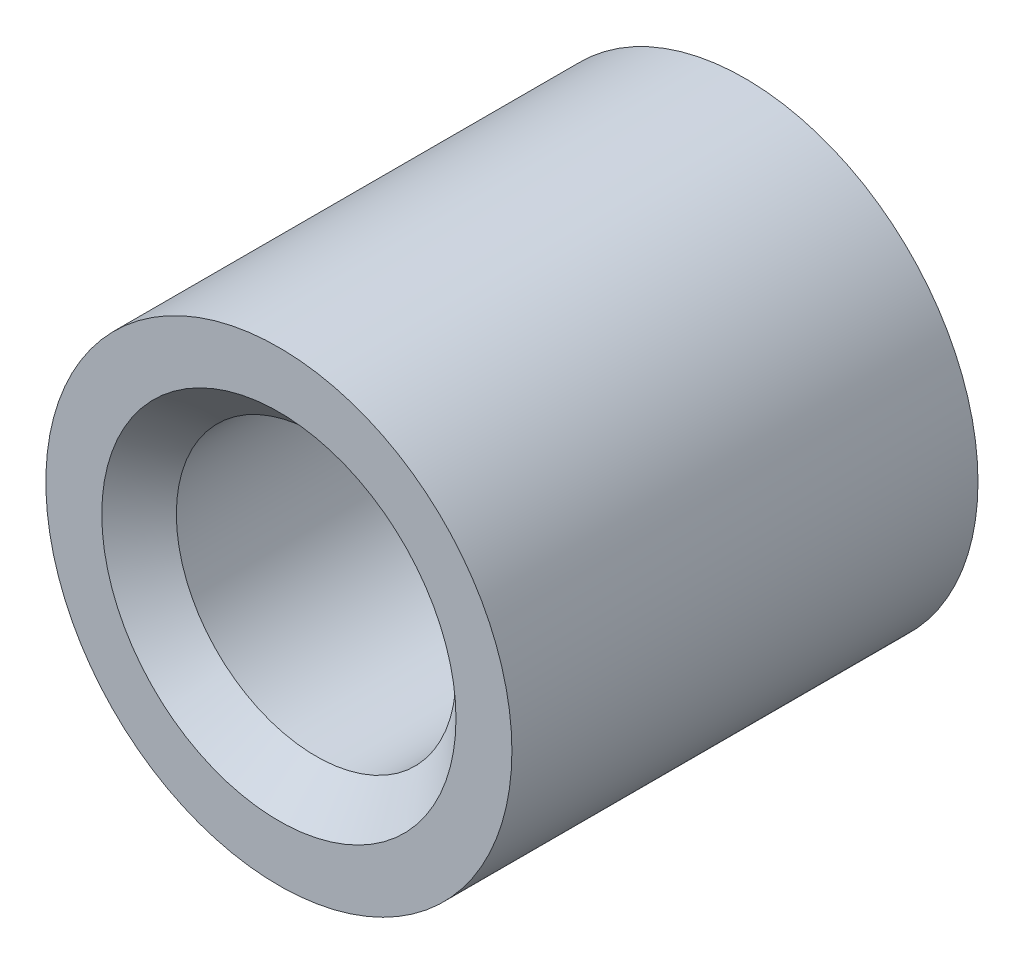
ISO-10303-21;
HEADER;
FILE_DESCRIPTION(('STEP AP214'),'2;1');
FILE_NAME('part.step','',(''),(''),'','','');
FILE_SCHEMA(('AUTOMOTIVE_DESIGN { 1 0 10303 214 1 1 1 1 }'));
ENDSEC;
DATA;
#1=APPLICATION_CONTEXT('core data for automotive mechanical design processes');
#2=APPLICATION_PROTOCOL_DEFINITION('international standard','automotive_design',2000,#1);
#3=PRODUCT_CONTEXT('',#1,'mechanical');
#4=PRODUCT('Part','Part','',(#3));
#5=PRODUCT_RELATED_PRODUCT_CATEGORY('part','',(#4));
#6=PRODUCT_DEFINITION_FORMATION('','',#4);
#7=PRODUCT_DEFINITION_CONTEXT('part definition',#1,'design');
#8=PRODUCT_DEFINITION('design','',#6,#7);
#9=PRODUCT_DEFINITION_SHAPE('','',#8);
#10=(LENGTH_UNIT() NAMED_UNIT(*) SI_UNIT(.MILLI.,.METRE.));
#11=(NAMED_UNIT(*) PLANE_ANGLE_UNIT() SI_UNIT($,.RADIAN.));
#12=(NAMED_UNIT(*) SI_UNIT($,.STERADIAN.) SOLID_ANGLE_UNIT());
#13=UNCERTAINTY_MEASURE_WITH_UNIT(LENGTH_MEASURE(1.E-05),#10,'distance_accuracy_value','');
#14=(GEOMETRIC_REPRESENTATION_CONTEXT(3) GLOBAL_UNCERTAINTY_ASSIGNED_CONTEXT((#13)) GLOBAL_UNIT_ASSIGNED_CONTEXT((#10,
#11,#12)) REPRESENTATION_CONTEXT('',''));
#15=CARTESIAN_POINT('',(0.,0.,0.));
#16=DIRECTION('',(0.,0.,1.));
#17=DIRECTION('',(1.,0.,0.));
#18=AXIS2_PLACEMENT_3D('',#15,#16,#17);
#19=CARTESIAN_POINT('',(0.,0.,15.875));
#20=DIRECTION('',(0.,0.,1.));
#21=DIRECTION('',(1.,0.,0.));
#22=AXIS2_PLACEMENT_3D('',#19,#20,#21);
#23=PLANE('',#22);
#24=CARTESIAN_POINT('',(0.,0.,15.875));
#25=DIRECTION('',(0.,0.,1.));
#26=DIRECTION('',(1.,0.,0.));
#27=AXIS2_PLACEMENT_3D('',#24,#25,#26);
#28=CIRCLE('',#27,6.03250000000001);
#29=CARTESIAN_POINT('',(6.03250000000001,0.,15.875));
#30=VERTEX_POINT('',#29);
#31=EDGE_CURVE('E10',#30,#30,#28,.F.);
#32=ORIENTED_EDGE('',*,*,#31,.T.);
#33=EDGE_LOOP('',(#32));
#34=FACE_BOUND('',#33,.T.);
#35=CARTESIAN_POINT('',(0.,0.,15.875));
#36=DIRECTION('',(0.,0.,1.));
#37=DIRECTION('',(1.,0.,0.));
#38=AXIS2_PLACEMENT_3D('',#35,#36,#37);
#39=CIRCLE('',#38,7.9375);
#40=CARTESIAN_POINT('',(7.9375,0.,15.875));
#41=VERTEX_POINT('',#40);
#42=EDGE_CURVE('E58',#41,#41,#39,.T.);
#43=ORIENTED_EDGE('',*,*,#42,.T.);
#44=EDGE_LOOP('',(#43));
#45=FACE_BOUND('',#44,.T.);
#46=ADVANCED_FACE('F39',(#34,#45),#23,.T.);
#47=CARTESIAN_POINT('',(0.,0.,0.));
#48=DIRECTION('',(0.,0.,1.));
#49=DIRECTION('',(1.,0.,0.));
#50=AXIS2_PLACEMENT_3D('',#47,#48,#49);
#51=PLANE('',#50);
#52=CARTESIAN_POINT('',(0.,0.,0.));
#53=DIRECTION('',(0.,0.,1.));
#54=DIRECTION('',(1.,0.,0.));
#55=AXIS2_PLACEMENT_3D('',#52,#53,#54);
#56=CIRCLE('',#55,6.0325);
#57=CARTESIAN_POINT('',(6.0325,0.,0.));
#58=VERTEX_POINT('',#57);
#59=EDGE_CURVE('E54',#58,#58,#56,.T.);
#60=ORIENTED_EDGE('',*,*,#59,.T.);
#61=EDGE_LOOP('',(#60));
#62=FACE_BOUND('',#61,.T.);
#63=CARTESIAN_POINT('',(0.,0.,0.));
#64=DIRECTION('',(0.,0.,1.));
#65=DIRECTION('',(1.,0.,0.));
#66=AXIS2_PLACEMENT_3D('',#63,#64,#65);
#67=CIRCLE('',#66,7.9375);
#68=CARTESIAN_POINT('',(7.9375,0.,0.));
#69=VERTEX_POINT('',#68);
#70=EDGE_CURVE('E62',#69,#69,#67,.T.);
#71=ORIENTED_EDGE('',*,*,#70,.F.);
#72=EDGE_LOOP('',(#71));
#73=FACE_BOUND('',#72,.T.);
#74=ADVANCED_FACE('F75',(#62,#73),#51,.F.);
#75=CARTESIAN_POINT('',(0.,0.,15.875));
#76=DIRECTION('',(0.,0.,-1.));
#77=DIRECTION('',(-1.,0.,0.));
#78=AXIS2_PLACEMENT_3D('',#75,#76,#77);
#79=CYLINDRICAL_SURFACE('',#78,7.9375);
#80=ORIENTED_EDGE('',*,*,#42,.F.);
#81=EDGE_LOOP('',(#80));
#82=FACE_BOUND('',#81,.T.);
#83=ORIENTED_EDGE('',*,*,#70,.T.);
#84=EDGE_LOOP('',(#83));
#85=FACE_BOUND('',#84,.T.);
#86=ADVANCED_FACE('F70',(#82,#85),#79,.T.);
#87=CARTESIAN_POINT('',(0.,0.,15.875));
#88=DIRECTION('',(0.,0.,-1.));
#89=DIRECTION('',(-1.,0.,0.));
#90=AXIS2_PLACEMENT_3D('',#87,#88,#89);
#91=CYLINDRICAL_SURFACE('',#90,4.7625);
#92=CARTESIAN_POINT('',(0.,0.,1.27));
#93=DIRECTION('',(0.,0.,1.));
#94=DIRECTION('',(1.,0.,0.));
#95=AXIS2_PLACEMENT_3D('',#92,#93,#94);
#96=CIRCLE('',#95,4.7625);
#97=CARTESIAN_POINT('',(4.7625,0.,1.27));
#98=VERTEX_POINT('',#97);
#99=EDGE_CURVE('E50',#98,#98,#96,.F.);
#100=ORIENTED_EDGE('',*,*,#99,.T.);
#101=EDGE_LOOP('',(#100));
#102=FACE_BOUND('',#101,.T.);
#103=CARTESIAN_POINT('',(0.,0.,14.605));
#104=DIRECTION('',(0.,0.,1.));
#105=DIRECTION('',(1.,0.,0.));
#106=AXIS2_PLACEMENT_3D('',#103,#104,#105);
#107=CIRCLE('',#106,4.7625);
#108=CARTESIAN_POINT('',(4.7625,0.,14.605));
#109=VERTEX_POINT('',#108);
#110=EDGE_CURVE('E51',#109,#109,#107,.T.);
#111=ORIENTED_EDGE('',*,*,#110,.T.);
#112=EDGE_LOOP('',(#111));
#113=FACE_BOUND('',#112,.T.);
#114=ADVANCED_FACE('F72',(#102,#113),#91,.F.);
#115=CARTESIAN_POINT('',(0.,0.,0.));
#116=DIRECTION('',(0.,0.,-1.));
#117=DIRECTION('',(-1.,0.,0.));
#118=AXIS2_PLACEMENT_3D('',#115,#116,#117);
#119=CONICAL_SURFACE('',#118,6.0325,0.785398163397445);
#120=ORIENTED_EDGE('',*,*,#99,.F.);
#121=EDGE_LOOP('',(#120));
#122=FACE_BOUND('',#121,.T.);
#123=ORIENTED_EDGE('',*,*,#59,.F.);
#124=EDGE_LOOP('',(#123));
#125=FACE_BOUND('',#124,.T.);
#126=ADVANCED_FACE('F88',(#122,#125),#119,.F.);
#127=CARTESIAN_POINT('',(0.,0.,14.605));
#128=DIRECTION('',(0.,0.,1.));
#129=DIRECTION('',(1.,0.,0.));
#130=AXIS2_PLACEMENT_3D('',#127,#128,#129);
#131=CONICAL_SURFACE('',#130,4.7625,0.785398163397448);
#132=CARTESIAN_POINT('',(6.03250000000001,0.,15.875));
#133=CARTESIAN_POINT('',(6.01927083333334,0.,15.8617708333333));
#134=CARTESIAN_POINT('',(6.00604166666668,0.,15.8485416666667));
#135=CARTESIAN_POINT('',(5.97958333333334,0.,15.8220833333333));
#136=CARTESIAN_POINT('',(5.96635416666667,0.,15.8088541666667));
#137=CARTESIAN_POINT('',(5.93989583333334,0.,15.7823958333333));
#138=CARTESIAN_POINT('',(5.92666666666667,0.,15.7691666666667));
#139=CARTESIAN_POINT('',(5.90020833333334,0.,15.7427083333333));
#140=CARTESIAN_POINT('',(5.88697916666667,0.,15.7294791666667));
#141=CARTESIAN_POINT('',(5.86052083333334,0.,15.7030208333333));
#142=CARTESIAN_POINT('',(5.84729166666667,0.,15.6897916666667));
#143=CARTESIAN_POINT('',(5.82083333333334,0.,15.6633333333333));
#144=CARTESIAN_POINT('',(5.80760416666667,0.,15.6501041666667));
#145=CARTESIAN_POINT('',(5.78114583333334,0.,15.6236458333333));
#146=CARTESIAN_POINT('',(5.76791666666667,0.,15.6104166666667));
#147=CARTESIAN_POINT('',(5.74145833333334,0.,15.5839583333333));
#148=CARTESIAN_POINT('',(5.72822916666667,0.,15.5707291666667));
#149=CARTESIAN_POINT('',(5.70177083333334,0.,15.5442708333333));
#150=CARTESIAN_POINT('',(5.68854166666667,0.,15.5310416666667));
#151=CARTESIAN_POINT('',(5.66208333333334,0.,15.5045833333333));
#152=CARTESIAN_POINT('',(5.64885416666667,0.,15.4913541666667));
#153=CARTESIAN_POINT('',(5.62239583333334,0.,15.4648958333333));
#154=CARTESIAN_POINT('',(5.60916666666667,0.,15.4516666666667));
#155=CARTESIAN_POINT('',(5.58270833333334,0.,15.4252083333333));
#156=CARTESIAN_POINT('',(5.56947916666667,0.,15.4119791666667));
#157=CARTESIAN_POINT('',(5.54302083333334,0.,15.3855208333333));
#158=CARTESIAN_POINT('',(5.52979166666667,0.,15.3722916666667));
#159=CARTESIAN_POINT('',(5.50333333333334,0.,15.3458333333333));
#160=CARTESIAN_POINT('',(5.49010416666667,0.,15.3326041666667));
#161=CARTESIAN_POINT('',(5.46364583333334,0.,15.3061458333333));
#162=CARTESIAN_POINT('',(5.45041666666667,0.,15.2929166666667));
#163=CARTESIAN_POINT('',(5.42395833333334,0.,15.2664583333333));
#164=CARTESIAN_POINT('',(5.41072916666667,0.,15.2532291666667));
#165=CARTESIAN_POINT('',(5.38427083333334,0.,15.2267708333333));
#166=CARTESIAN_POINT('',(5.37104166666667,0.,15.2135416666667));
#167=CARTESIAN_POINT('',(5.34458333333334,0.,15.1870833333333));
#168=CARTESIAN_POINT('',(5.33135416666667,0.,15.1738541666667));
#169=CARTESIAN_POINT('',(5.30489583333334,0.,15.1473958333333));
#170=CARTESIAN_POINT('',(5.29166666666667,0.,15.1341666666667));
#171=CARTESIAN_POINT('',(5.26520833333334,0.,15.1077083333333));
#172=CARTESIAN_POINT('',(5.25197916666667,0.,15.0944791666667));
#173=CARTESIAN_POINT('',(5.22552083333334,0.,15.0680208333333));
#174=CARTESIAN_POINT('',(5.21229166666667,0.,15.0547916666667));
#175=CARTESIAN_POINT('',(5.18583333333334,0.,15.0283333333333));
#176=CARTESIAN_POINT('',(5.17260416666667,0.,15.0151041666667));
#177=CARTESIAN_POINT('',(5.14614583333334,0.,14.9886458333333));
#178=CARTESIAN_POINT('',(5.13291666666667,0.,14.9754166666667));
#179=CARTESIAN_POINT('',(5.10645833333334,0.,14.9489583333333));
#180=CARTESIAN_POINT('',(5.09322916666667,0.,14.9357291666667));
#181=CARTESIAN_POINT('',(5.06677083333333,0.,14.9092708333333));
#182=CARTESIAN_POINT('',(5.05354166666667,0.,14.8960416666667));
#183=CARTESIAN_POINT('',(5.02708333333333,0.,14.8695833333333));
#184=CARTESIAN_POINT('',(5.01385416666667,0.,14.8563541666667));
#185=CARTESIAN_POINT('',(4.98739583333333,0.,14.8298958333333));
#186=CARTESIAN_POINT('',(4.97416666666667,0.,14.8166666666667));
#187=CARTESIAN_POINT('',(4.94770833333333,0.,14.7902083333333));
#188=CARTESIAN_POINT('',(4.93447916666667,0.,14.7769791666667));
#189=CARTESIAN_POINT('',(4.90802083333333,0.,14.7505208333333));
#190=CARTESIAN_POINT('',(4.89479166666667,0.,14.7372916666667));
#191=CARTESIAN_POINT('',(4.86833333333333,0.,14.7108333333333));
#192=CARTESIAN_POINT('',(4.85510416666667,0.,14.6976041666667));
#193=CARTESIAN_POINT('',(4.82864583333333,0.,14.6711458333333));
#194=CARTESIAN_POINT('',(4.81541666666667,0.,14.6579166666667));
#195=CARTESIAN_POINT('',(4.78895833333333,0.,14.6314583333333));
#196=CARTESIAN_POINT('',(4.77572916666667,0.,14.6182291666667));
#197=CARTESIAN_POINT('',(4.7625,0.,14.605));
#198=B_SPLINE_CURVE_WITH_KNOTS('',3,(#132,#133,#134,#135,#136,#137,#138,#139,#140,#141,#142,
#143,#144,#145,#146,#147,#148,#149,#150,#151,#152,#153,#154,#155,#156,#157,#158,#159,#160,#161,
#162,#163,#164,#165,#166,#167,#168,#169,#170,#171,#172,#173,#174,#175,#176,#177,#178,#179,#180,
#181,#182,#183,#184,#185,#186,#187,#188,#189,#190,#191,#192,#193,#194,#195,#196,#197),
.UNSPECIFIED.,.F.,.F.,(4,2,2,2,2,2,2,2,2,2,2,2,2,2,2,2,2,2,2,2,2,2,2,2,2,2,2,2,2,2,2,2,4),(0.,
0.0561266007566819,0.112253201513364,0.168379802270047,0.224506403026729,0.280633003783411,
0.336759604540093,0.392886205296777,0.449012806053459,0.505139406810143,0.561266007566825,
0.617392608323507,0.673519209080191,0.729645809836873,0.785772410593555,0.841899011350238,
0.898025612106921,0.954152212863604,1.01027881362029,1.06640541437697,1.12253201513365,
1.17865861589033,1.23478521664702,1.2909118174037,1.34703841816038,1.40316501891706,
1.45929161967375,1.51541822043043,1.57154482118711,1.6276714219438,1.68379802270048,
1.73992462345716,1.79605122421384),.UNSPECIFIED.);
#199=EDGE_CURVE('BSEAM45',#30,#109,#198,.T.);
#200=ORIENTED_EDGE('',*,*,#31,.F.);
#201=ORIENTED_EDGE('',*,*,#110,.F.);
#202=ORIENTED_EDGE('',*,*,#199,.T.);
#203=ORIENTED_EDGE('',*,*,#199,.F.);
#204=EDGE_LOOP('',(#200,#202,#201,#203));
#205=FACE_BOUND('',#204,.T.);
#206=ADVANCED_FACE('F45',(#205),#131,.F.);
#207=CLOSED_SHELL('',(#46,#74,#86,#114,#126,#206));
#208=MANIFOLD_SOLID_BREP('B2',#207);
#209=ADVANCED_BREP_SHAPE_REPRESENTATION('',(#18,#208),#14);
#210=SHAPE_DEFINITION_REPRESENTATION(#9,#209);
ENDSEC;
END-ISO-10303-21;
